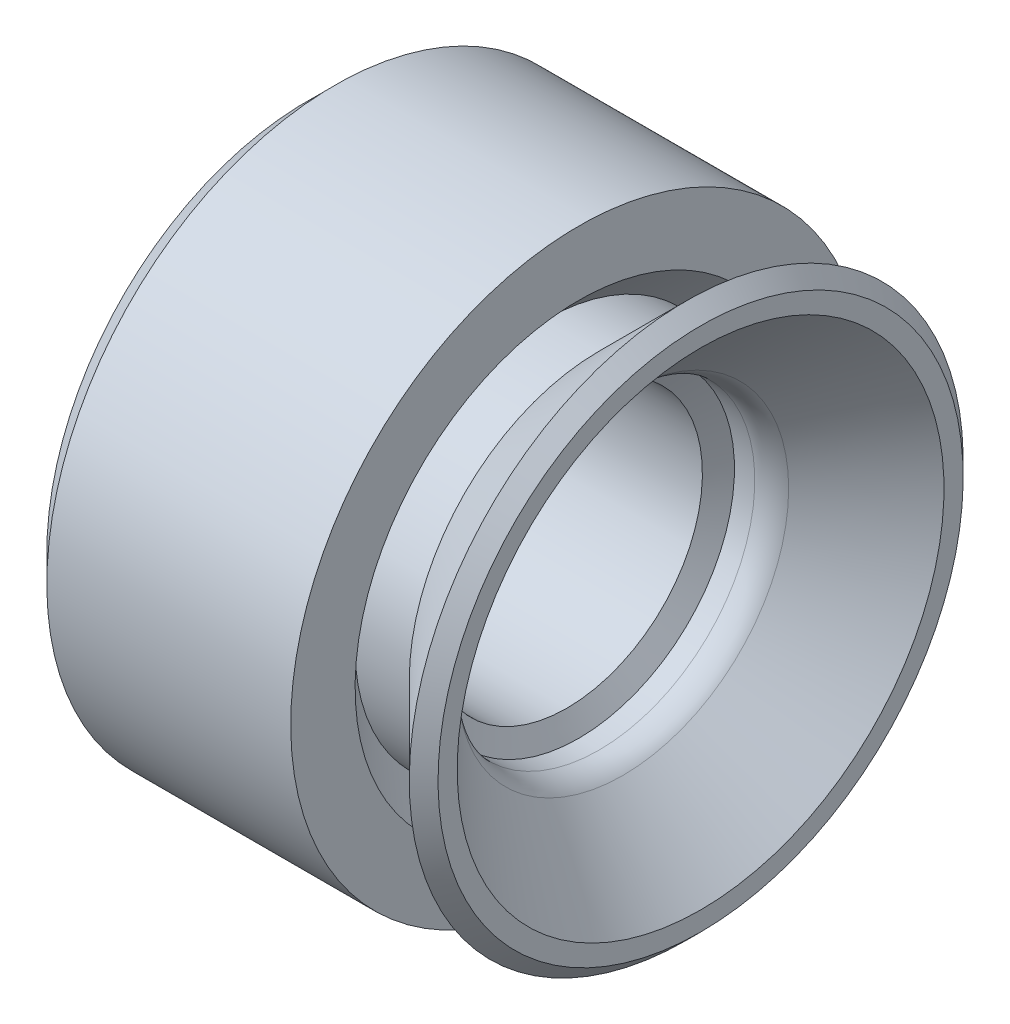
ISO-10303-21;
HEADER;
FILE_DESCRIPTION(('STEP AP214'),'2;1');
FILE_NAME('part.step','',(''),(''),'','','');
FILE_SCHEMA(('AUTOMOTIVE_DESIGN { 1 0 10303 214 1 1 1 1 }'));
ENDSEC;
DATA;
#1=APPLICATION_CONTEXT('core data for automotive mechanical design processes');
#2=APPLICATION_PROTOCOL_DEFINITION('international standard','automotive_design',2000,#1);
#3=PRODUCT_CONTEXT('',#1,'mechanical');
#4=PRODUCT('Part','Part','',(#3));
#5=PRODUCT_RELATED_PRODUCT_CATEGORY('part','',(#4));
#6=PRODUCT_DEFINITION_FORMATION('','',#4);
#7=PRODUCT_DEFINITION_CONTEXT('part definition',#1,'design');
#8=PRODUCT_DEFINITION('design','',#6,#7);
#9=PRODUCT_DEFINITION_SHAPE('','',#8);
#10=(LENGTH_UNIT() NAMED_UNIT(*) SI_UNIT(.MILLI.,.METRE.));
#11=(NAMED_UNIT(*) PLANE_ANGLE_UNIT() SI_UNIT($,.RADIAN.));
#12=(NAMED_UNIT(*) SI_UNIT($,.STERADIAN.) SOLID_ANGLE_UNIT());
#13=UNCERTAINTY_MEASURE_WITH_UNIT(LENGTH_MEASURE(1.E-05),#10,'distance_accuracy_value','');
#14=(GEOMETRIC_REPRESENTATION_CONTEXT(3) GLOBAL_UNCERTAINTY_ASSIGNED_CONTEXT((#13)) GLOBAL_UNIT_ASSIGNED_CONTEXT((#10,
#11,#12)) REPRESENTATION_CONTEXT('',''));
#15=CARTESIAN_POINT('',(0.,0.,0.));
#16=DIRECTION('',(0.,0.,1.));
#17=DIRECTION('',(1.,0.,0.));
#18=AXIS2_PLACEMENT_3D('',#15,#16,#17);
#19=CARTESIAN_POINT('',(1.78786796564404,0.,0.));
#20=DIRECTION('',(-1.,0.,0.));
#21=DIRECTION('',(0.,-1.,0.));
#22=AXIS2_PLACEMENT_3D('',#19,#20,#21);
#23=CONICAL_SURFACE('',#22,4.08786796564404,0.785398163397452);
#24=CARTESIAN_POINT('',(2.,0.,0.));
#25=DIRECTION('',(-1.,0.,0.));
#26=DIRECTION('',(0.,-1.,0.));
#27=AXIS2_PLACEMENT_3D('',#24,#25,#26);
#28=CIRCLE('',#27,3.87573593128808);
#29=CARTESIAN_POINT('',(2.,-3.87573593128808,0.));
#30=VERTEX_POINT('',#29);
#31=EDGE_CURVE('E10',#30,#30,#28,.T.);
#32=ORIENTED_EDGE('',*,*,#31,.T.);
#33=EDGE_LOOP('',(#32));
#34=FACE_BOUND('',#33,.T.);
#35=CARTESIAN_POINT('',(1.78786796564404,0.,0.));
#36=DIRECTION('',(-1.,0.,0.));
#37=DIRECTION('',(0.,-1.,0.));
#38=AXIS2_PLACEMENT_3D('',#35,#36,#37);
#39=CIRCLE('',#38,4.08786796564404);
#40=CARTESIAN_POINT('',(1.78786796564404,-4.08786796564404,0.));
#41=VERTEX_POINT('',#40);
#42=EDGE_CURVE('E86',#41,#41,#39,.T.);
#43=ORIENTED_EDGE('',*,*,#42,.F.);
#44=EDGE_LOOP('',(#43));
#45=FACE_BOUND('',#44,.T.);
#46=ADVANCED_FACE('F37',(#34,#45),#23,.T.);
#47=CARTESIAN_POINT('',(2.,-3.59289321881346,0.));
#48=DIRECTION('',(1.,0.,0.));
#49=DIRECTION('',(0.,1.,0.));
#50=AXIS2_PLACEMENT_3D('',#47,#48,#49);
#51=PLANE('',#50);
#52=CARTESIAN_POINT('',(2.,0.,0.));
#53=DIRECTION('',(-1.,0.,0.));
#54=DIRECTION('',(0.,-1.,0.));
#55=AXIS2_PLACEMENT_3D('',#52,#53,#54);
#56=CIRCLE('',#55,3.59289321881346);
#57=CARTESIAN_POINT('',(2.,-3.59289321881346,0.));
#58=VERTEX_POINT('',#57);
#59=EDGE_CURVE('E43',#58,#58,#56,.T.);
#60=ORIENTED_EDGE('',*,*,#59,.T.);
#61=EDGE_LOOP('',(#60));
#62=FACE_BOUND('',#61,.T.);
#63=ORIENTED_EDGE('',*,*,#31,.F.);
#64=EDGE_LOOP('',(#63));
#65=FACE_BOUND('',#64,.T.);
#66=ADVANCED_FACE('F94',(#62,#65),#51,.T.);
#67=CARTESIAN_POINT('',(2.,0.,0.));
#68=DIRECTION('',(1.,0.,0.));
#69=DIRECTION('',(0.,1.,0.));
#70=AXIS2_PLACEMENT_3D('',#67,#68,#69);
#71=CONICAL_SURFACE('',#70,3.59289321881346,0.785398163397443);
#72=CARTESIAN_POINT('',(0.853553390593257,0.,0.));
#73=DIRECTION('',(-1.,0.,0.));
#74=DIRECTION('',(0.,-1.,0.));
#75=AXIS2_PLACEMENT_3D('',#72,#73,#74);
#76=CIRCLE('',#75,2.44644660940672);
#77=CARTESIAN_POINT('',(0.853553390593258,-2.44644660940672,0.));
#78=VERTEX_POINT('',#77);
#79=EDGE_CURVE('E47',#78,#78,#76,.T.);
#80=ORIENTED_EDGE('',*,*,#79,.T.);
#81=EDGE_LOOP('',(#80));
#82=FACE_BOUND('',#81,.T.);
#83=ORIENTED_EDGE('',*,*,#59,.F.);
#84=EDGE_LOOP('',(#83));
#85=FACE_BOUND('',#84,.T.);
#86=ADVANCED_FACE('F98',(#82,#85),#71,.F.);
#87=CARTESIAN_POINT('',(0.499999999999985,0.,0.));
#88=DIRECTION('',(-1.,0.,0.));
#89=DIRECTION('',(0.,-1.,0.));
#90=AXIS2_PLACEMENT_3D('',#87,#88,#89);
#91=TOROIDAL_SURFACE('',#90,2.8,0.5);
#92=CARTESIAN_POINT('',(0.499999999999985,0.,0.));
#93=DIRECTION('',(-1.,0.,0.));
#94=DIRECTION('',(0.,-1.,0.));
#95=AXIS2_PLACEMENT_3D('',#92,#93,#94);
#96=CIRCLE('',#95,2.3);
#97=CARTESIAN_POINT('',(0.499999999999986,-2.3,0.));
#98=VERTEX_POINT('',#97);
#99=EDGE_CURVE('E51',#98,#98,#96,.T.);
#100=ORIENTED_EDGE('',*,*,#99,.T.);
#101=EDGE_LOOP('',(#100));
#102=FACE_BOUND('',#101,.T.);
#103=ORIENTED_EDGE('',*,*,#79,.F.);
#104=EDGE_LOOP('',(#103));
#105=FACE_BOUND('',#104,.T.);
#106=ADVANCED_FACE('F102',(#102,#105),#91,.T.);
#107=CARTESIAN_POINT('',(0.,0.,0.));
#108=DIRECTION('',(-1.,0.,0.));
#109=DIRECTION('',(0.,-1.,0.));
#110=AXIS2_PLACEMENT_3D('',#107,#108,#109);
#111=CYLINDRICAL_SURFACE('',#110,2.3);
#112=CARTESIAN_POINT('',(0.2,0.,0.));
#113=DIRECTION('',(-1.,0.,0.));
#114=DIRECTION('',(0.,-1.,0.));
#115=AXIS2_PLACEMENT_3D('',#112,#113,#114);
#116=CIRCLE('',#115,2.3);
#117=CARTESIAN_POINT('',(0.2,-2.3,0.));
#118=VERTEX_POINT('',#117);
#119=EDGE_CURVE('E56',#118,#118,#116,.T.);
#120=ORIENTED_EDGE('',*,*,#119,.T.);
#121=EDGE_LOOP('',(#120));
#122=FACE_BOUND('',#121,.T.);
#123=ORIENTED_EDGE('',*,*,#99,.F.);
#124=EDGE_LOOP('',(#123));
#125=FACE_BOUND('',#124,.T.);
#126=ADVANCED_FACE('F109',(#122,#125),#111,.F.);
#127=CARTESIAN_POINT('',(0.2,0.,0.));
#128=DIRECTION('',(1.,0.,0.));
#129=DIRECTION('',(0.,1.,0.));
#130=AXIS2_PLACEMENT_3D('',#127,#128,#129);
#131=CONICAL_SURFACE('',#130,2.3,1.04719755119659);
#132=CARTESIAN_POINT('',(0.0267949192431102,0.,0.));
#133=DIRECTION('',(-1.,0.,0.));
#134=DIRECTION('',(0.,-1.,0.));
#135=AXIS2_PLACEMENT_3D('',#132,#133,#134);
#136=CIRCLE('',#135,2.);
#137=CARTESIAN_POINT('',(0.0267949192431107,-2.,0.));
#138=VERTEX_POINT('',#137);
#139=EDGE_CURVE('E59',#138,#138,#136,.T.);
#140=ORIENTED_EDGE('',*,*,#139,.T.);
#141=EDGE_LOOP('',(#140));
#142=FACE_BOUND('',#141,.T.);
#143=ORIENTED_EDGE('',*,*,#119,.F.);
#144=EDGE_LOOP('',(#143));
#145=FACE_BOUND('',#144,.T.);
#146=ADVANCED_FACE('F113',(#142,#145),#131,.F.);
#147=CARTESIAN_POINT('',(0.,0.,0.));
#148=DIRECTION('',(-1.,0.,0.));
#149=DIRECTION('',(0.,-1.,0.));
#150=AXIS2_PLACEMENT_3D('',#147,#148,#149);
#151=CYLINDRICAL_SURFACE('',#150,2.);
#152=CARTESIAN_POINT('',(-3.51132486540519,0.,0.));
#153=DIRECTION('',(-1.,0.,0.));
#154=DIRECTION('',(0.,-1.,0.));
#155=AXIS2_PLACEMENT_3D('',#152,#153,#154);
#156=CIRCLE('',#155,2.);
#157=CARTESIAN_POINT('',(-3.51132486540519,-2.,0.));
#158=VERTEX_POINT('',#157);
#159=EDGE_CURVE('E62',#158,#158,#156,.T.);
#160=ORIENTED_EDGE('',*,*,#159,.T.);
#161=EDGE_LOOP('',(#160));
#162=FACE_BOUND('',#161,.T.);
#163=ORIENTED_EDGE('',*,*,#139,.F.);
#164=EDGE_LOOP('',(#163));
#165=FACE_BOUND('',#164,.T.);
#166=ADVANCED_FACE('F117',(#162,#165),#151,.F.);
#167=CARTESIAN_POINT('',(-3.51132486540519,0.,0.));
#168=DIRECTION('',(-1.,0.,0.));
#169=DIRECTION('',(0.,-1.,0.));
#170=AXIS2_PLACEMENT_3D('',#167,#168,#169);
#171=CONICAL_SURFACE('',#170,2.,1.0471975511966);
#172=CARTESIAN_POINT('',(-3.8,0.,0.));
#173=DIRECTION('',(-1.,0.,0.));
#174=DIRECTION('',(0.,-1.,0.));
#175=AXIS2_PLACEMENT_3D('',#172,#173,#174);
#176=CIRCLE('',#175,2.5);
#177=CARTESIAN_POINT('',(-3.8,-2.5,0.));
#178=VERTEX_POINT('',#177);
#179=EDGE_CURVE('E65',#178,#178,#176,.T.);
#180=ORIENTED_EDGE('',*,*,#179,.T.);
#181=EDGE_LOOP('',(#180));
#182=FACE_BOUND('',#181,.T.);
#183=ORIENTED_EDGE('',*,*,#159,.F.);
#184=EDGE_LOOP('',(#183));
#185=FACE_BOUND('',#184,.T.);
#186=ADVANCED_FACE('F121',(#182,#185),#171,.F.);
#187=CARTESIAN_POINT('',(-3.8,-3.85,0.));
#188=DIRECTION('',(-1.,0.,0.));
#189=DIRECTION('',(0.,-1.,0.));
#190=AXIS2_PLACEMENT_3D('',#187,#188,#189);
#191=PLANE('',#190);
#192=CARTESIAN_POINT('',(-3.8,0.,0.));
#193=DIRECTION('',(-1.,0.,0.));
#194=DIRECTION('',(0.,-1.,0.));
#195=AXIS2_PLACEMENT_3D('',#192,#193,#194);
#196=CIRCLE('',#195,3.85);
#197=CARTESIAN_POINT('',(-3.8,-3.85,0.));
#198=VERTEX_POINT('',#197);
#199=EDGE_CURVE('E68',#198,#198,#196,.T.);
#200=ORIENTED_EDGE('',*,*,#199,.T.);
#201=EDGE_LOOP('',(#200));
#202=FACE_BOUND('',#201,.T.);
#203=ORIENTED_EDGE('',*,*,#179,.F.);
#204=EDGE_LOOP('',(#203));
#205=FACE_BOUND('',#204,.T.);
#206=ADVANCED_FACE('F125',(#202,#205),#191,.T.);
#207=CARTESIAN_POINT('',(-3.8,0.,0.));
#208=DIRECTION('',(1.,0.,0.));
#209=DIRECTION('',(0.,1.,0.));
#210=AXIS2_PLACEMENT_3D('',#207,#208,#209);
#211=CONICAL_SURFACE('',#210,3.85,0.78539816339745);
#212=CARTESIAN_POINT('',(-3.4,0.,0.));
#213=DIRECTION('',(-1.,0.,0.));
#214=DIRECTION('',(0.,-1.,0.));
#215=AXIS2_PLACEMENT_3D('',#212,#213,#214);
#216=CIRCLE('',#215,4.25);
#217=CARTESIAN_POINT('',(-3.4,-4.25,0.));
#218=VERTEX_POINT('',#217);
#219=EDGE_CURVE('E71',#218,#218,#216,.T.);
#220=ORIENTED_EDGE('',*,*,#219,.T.);
#221=EDGE_LOOP('',(#220));
#222=FACE_BOUND('',#221,.T.);
#223=ORIENTED_EDGE('',*,*,#199,.F.);
#224=EDGE_LOOP('',(#223));
#225=FACE_BOUND('',#224,.T.);
#226=ADVANCED_FACE('F129',(#222,#225),#211,.T.);
#227=CARTESIAN_POINT('',(0.,0.,0.));
#228=DIRECTION('',(-1.,0.,0.));
#229=DIRECTION('',(0.,-1.,0.));
#230=AXIS2_PLACEMENT_3D('',#227,#228,#229);
#231=CYLINDRICAL_SURFACE('',#230,4.25);
#232=CARTESIAN_POINT('',(0.199999999999999,0.,0.));
#233=DIRECTION('',(-1.,0.,0.));
#234=DIRECTION('',(0.,-1.,0.));
#235=AXIS2_PLACEMENT_3D('',#232,#233,#234);
#236=CIRCLE('',#235,4.25);
#237=CARTESIAN_POINT('',(0.200000000000001,-4.25,0.));
#238=VERTEX_POINT('',#237);
#239=EDGE_CURVE('E74',#238,#238,#236,.T.);
#240=ORIENTED_EDGE('',*,*,#239,.T.);
#241=EDGE_LOOP('',(#240));
#242=FACE_BOUND('',#241,.T.);
#243=ORIENTED_EDGE('',*,*,#219,.F.);
#244=EDGE_LOOP('',(#243));
#245=FACE_BOUND('',#244,.T.);
#246=ADVANCED_FACE('F133',(#242,#245),#231,.T.);
#247=CARTESIAN_POINT('',(0.2,-3.3,0.));
#248=DIRECTION('',(1.,0.,0.));
#249=DIRECTION('',(0.,1.,0.));
#250=AXIS2_PLACEMENT_3D('',#247,#248,#249);
#251=PLANE('',#250);
#252=CARTESIAN_POINT('',(0.2,0.,0.));
#253=DIRECTION('',(-1.,0.,0.));
#254=DIRECTION('',(0.,-1.,0.));
#255=AXIS2_PLACEMENT_3D('',#252,#253,#254);
#256=CIRCLE('',#255,3.3);
#257=CARTESIAN_POINT('',(0.2,-3.3,0.));
#258=VERTEX_POINT('',#257);
#259=EDGE_CURVE('E77',#258,#258,#256,.T.);
#260=ORIENTED_EDGE('',*,*,#259,.T.);
#261=EDGE_LOOP('',(#260));
#262=FACE_BOUND('',#261,.T.);
#263=ORIENTED_EDGE('',*,*,#239,.F.);
#264=EDGE_LOOP('',(#263));
#265=FACE_BOUND('',#264,.T.);
#266=ADVANCED_FACE('F137',(#262,#265),#251,.T.);
#267=CARTESIAN_POINT('',(0.2,0.,0.));
#268=DIRECTION('',(1.,0.,0.));
#269=DIRECTION('',(0.,1.,0.));
#270=AXIS2_PLACEMENT_3D('',#267,#268,#269);
#271=CONICAL_SURFACE('',#270,3.3,0.78539816339745);
#272=CARTESIAN_POINT('',(-0.299999999999999,0.,0.));
#273=DIRECTION('',(-1.,0.,0.));
#274=DIRECTION('',(0.,-1.,0.));
#275=AXIS2_PLACEMENT_3D('',#272,#273,#274);
#276=CIRCLE('',#275,2.8);
#277=CARTESIAN_POINT('',(-0.299999999999999,-2.8,0.));
#278=VERTEX_POINT('',#277);
#279=EDGE_CURVE('E80',#278,#278,#276,.T.);
#280=ORIENTED_EDGE('',*,*,#279,.T.);
#281=EDGE_LOOP('',(#280));
#282=FACE_BOUND('',#281,.T.);
#283=ORIENTED_EDGE('',*,*,#259,.F.);
#284=EDGE_LOOP('',(#283));
#285=FACE_BOUND('',#284,.T.);
#286=ADVANCED_FACE('F141',(#282,#285),#271,.F.);
#287=CARTESIAN_POINT('',(0.,0.,0.));
#288=DIRECTION('',(-1.,0.,0.));
#289=DIRECTION('',(0.,-1.,0.));
#290=AXIS2_PLACEMENT_3D('',#287,#288,#289);
#291=CYLINDRICAL_SURFACE('',#290,2.8);
#292=CARTESIAN_POINT('',(0.499999999999985,0.,0.));
#293=DIRECTION('',(-1.,0.,0.));
#294=DIRECTION('',(0.,-1.,0.));
#295=AXIS2_PLACEMENT_3D('',#292,#293,#294);
#296=CIRCLE('',#295,2.8);
#297=CARTESIAN_POINT('',(0.499999999999986,-2.8,0.));
#298=VERTEX_POINT('',#297);
#299=EDGE_CURVE('E83',#298,#298,#296,.T.);
#300=ORIENTED_EDGE('',*,*,#299,.T.);
#301=EDGE_LOOP('',(#300));
#302=FACE_BOUND('',#301,.T.);
#303=ORIENTED_EDGE('',*,*,#279,.F.);
#304=EDGE_LOOP('',(#303));
#305=FACE_BOUND('',#304,.T.);
#306=ADVANCED_FACE('F145',(#302,#305),#291,.T.);
#307=CARTESIAN_POINT('',(0.499999999999985,0.,0.));
#308=DIRECTION('',(1.,0.,0.));
#309=DIRECTION('',(0.,1.,0.));
#310=AXIS2_PLACEMENT_3D('',#307,#308,#309);
#311=CONICAL_SURFACE('',#310,2.8,0.785398163397443);
#312=ORIENTED_EDGE('',*,*,#42,.T.);
#313=EDGE_LOOP('',(#312));
#314=FACE_BOUND('',#313,.T.);
#315=ORIENTED_EDGE('',*,*,#299,.F.);
#316=EDGE_LOOP('',(#315));
#317=FACE_BOUND('',#316,.T.);
#318=ADVANCED_FACE('F90',(#314,#317),#311,.T.);
#319=CLOSED_SHELL('',(#46,#66,#86,#106,#126,#146,#166,#186,#206,#226,#246,#266,#286,#306,#318));
#320=MANIFOLD_SOLID_BREP('B2',#319);
#321=ADVANCED_BREP_SHAPE_REPRESENTATION('',(#18,#320),#14);
#322=SHAPE_DEFINITION_REPRESENTATION(#9,#321);
ENDSEC;
END-ISO-10303-21;
